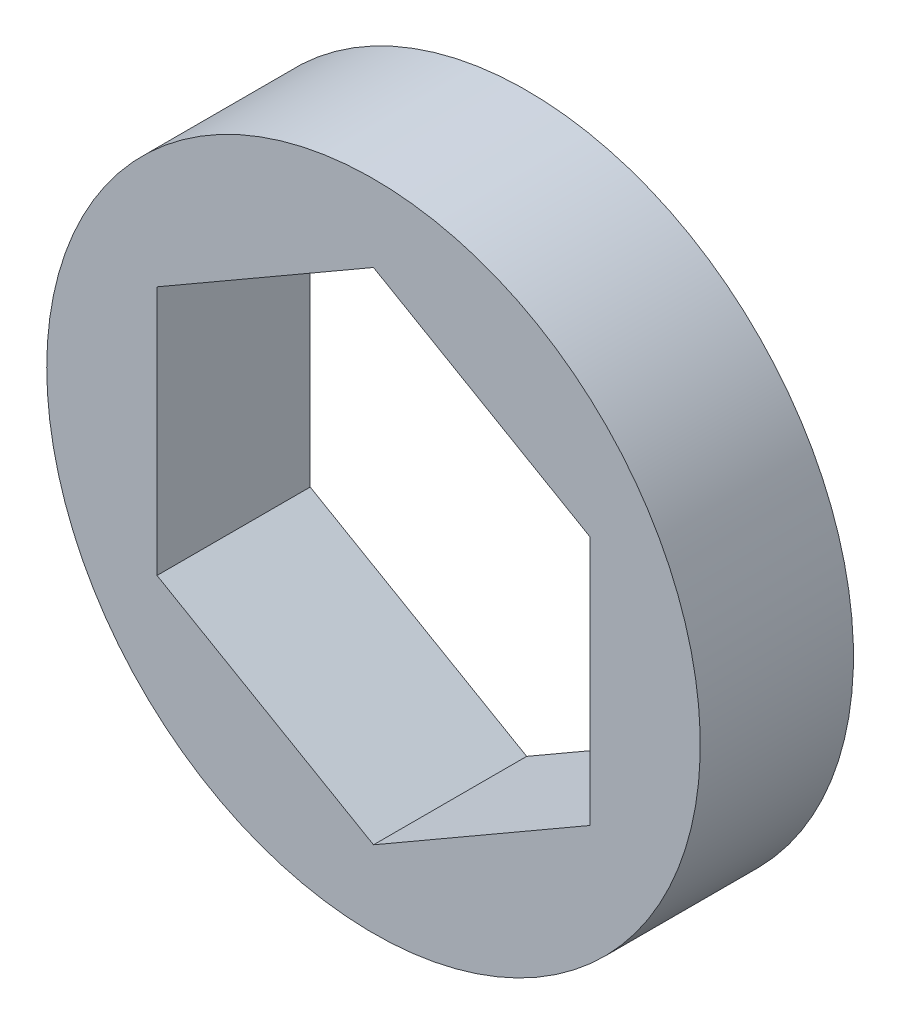
ISO-10303-21;
HEADER;
FILE_DESCRIPTION(('STEP AP214'),'2;1');
FILE_NAME('part.step','',(''),(''),'','','');
FILE_SCHEMA(('AUTOMOTIVE_DESIGN { 1 0 10303 214 1 1 1 1 }'));
ENDSEC;
DATA;
#1=APPLICATION_CONTEXT('core data for automotive mechanical design processes');
#2=APPLICATION_PROTOCOL_DEFINITION('international standard','automotive_design',2000,#1);
#3=PRODUCT_CONTEXT('',#1,'mechanical');
#4=PRODUCT('Part','Part','',(#3));
#5=PRODUCT_RELATED_PRODUCT_CATEGORY('part','',(#4));
#6=PRODUCT_DEFINITION_FORMATION('','',#4);
#7=PRODUCT_DEFINITION_CONTEXT('part definition',#1,'design');
#8=PRODUCT_DEFINITION('design','',#6,#7);
#9=PRODUCT_DEFINITION_SHAPE('','',#8);
#10=(LENGTH_UNIT() NAMED_UNIT(*) SI_UNIT(.MILLI.,.METRE.));
#11=(NAMED_UNIT(*) PLANE_ANGLE_UNIT() SI_UNIT($,.RADIAN.));
#12=(NAMED_UNIT(*) SI_UNIT($,.STERADIAN.) SOLID_ANGLE_UNIT());
#13=UNCERTAINTY_MEASURE_WITH_UNIT(LENGTH_MEASURE(1.E-05),#10,'distance_accuracy_value','');
#14=(GEOMETRIC_REPRESENTATION_CONTEXT(3) GLOBAL_UNCERTAINTY_ASSIGNED_CONTEXT((#13)) GLOBAL_UNIT_ASSIGNED_CONTEXT((#10,
#11,#12)) REPRESENTATION_CONTEXT('',''));
#15=CARTESIAN_POINT('',(0.,0.,0.));
#16=DIRECTION('',(0.,0.,1.));
#17=DIRECTION('',(1.,0.,0.));
#18=AXIS2_PLACEMENT_3D('',#15,#16,#17);
#19=CARTESIAN_POINT('',(0.,0.,2.38125));
#20=DIRECTION('',(0.,0.,1.));
#21=DIRECTION('',(1.,0.,0.));
#22=AXIS2_PLACEMENT_3D('',#19,#20,#21);
#23=PLANE('',#22);
#24=CARTESIAN_POINT('',(0.,0.,2.38125));
#25=DIRECTION('',(0.,0.,1.));
#26=DIRECTION('',(1.,0.,0.));
#27=AXIS2_PLACEMENT_3D('',#24,#25,#26);
#28=CIRCLE('',#27,10.16);
#29=CARTESIAN_POINT('',(-10.16,0.,2.38125));
#30=VERTEX_POINT('',#29);
#31=EDGE_CURVE('E11',#30,#30,#28,.T.);
#32=ORIENTED_EDGE('',*,*,#31,.T.);
#33=EDGE_LOOP('',(#32));
#34=FACE_BOUND('',#33,.T.);
#35=DIRECTION('',(-0.866025403784439,-0.5,0.));
#36=VECTOR('',#35,1.);
#37=CARTESIAN_POINT('',(0.,7.77228932383075,2.38125));
#38=LINE('',#37,#36);
#39=CARTESIAN_POINT('',(0.,7.77228932383075,2.38125));
#40=VERTEX_POINT('',#39);
#41=CARTESIAN_POINT('',(-6.73099999999999,3.88614466191538,2.38125));
#42=VERTEX_POINT('',#41);
#43=EDGE_CURVE('E98',#40,#42,#38,.T.);
#44=ORIENTED_EDGE('',*,*,#43,.F.);
#45=DIRECTION('',(-0.866025403784439,0.5,0.));
#46=VECTOR('',#45,1.);
#47=CARTESIAN_POINT('',(6.73099999999999,3.88614466191539,2.38125));
#48=LINE('',#47,#46);
#49=CARTESIAN_POINT('',(6.73099999999999,3.88614466191539,2.38125));
#50=VERTEX_POINT('',#49);
#51=EDGE_CURVE('E90',#50,#40,#48,.T.);
#52=ORIENTED_EDGE('',*,*,#51,.F.);
#53=DIRECTION('',(0.,1.,0.));
#54=VECTOR('',#53,1.);
#55=CARTESIAN_POINT('',(6.731,-3.88614466191539,2.38125));
#56=LINE('',#55,#54);
#57=CARTESIAN_POINT('',(6.731,-3.88614466191539,2.38125));
#58=VERTEX_POINT('',#57);
#59=EDGE_CURVE('E118',#58,#50,#56,.T.);
#60=ORIENTED_EDGE('',*,*,#59,.F.);
#61=DIRECTION('',(0.866025403784439,0.499999999999999,0.));
#62=VECTOR('',#61,1.);
#63=CARTESIAN_POINT('',(0.,-7.77228932383075,2.38125));
#64=LINE('',#63,#62);
#65=CARTESIAN_POINT('',(0.,-7.77228932383075,2.38125));
#66=VERTEX_POINT('',#65);
#67=EDGE_CURVE('E116',#66,#58,#64,.T.);
#68=ORIENTED_EDGE('',*,*,#67,.F.);
#69=DIRECTION('',(0.866025403784439,-0.499999999999999,0.));
#70=VECTOR('',#69,1.);
#71=CARTESIAN_POINT('',(-6.73099999999999,-3.88614466191539,2.38125));
#72=LINE('',#71,#70);
#73=CARTESIAN_POINT('',(-6.73099999999999,-3.88614466191539,2.38125));
#74=VERTEX_POINT('',#73);
#75=EDGE_CURVE('E112',#74,#66,#72,.T.);
#76=ORIENTED_EDGE('',*,*,#75,.F.);
#77=DIRECTION('',(0.,-1.,0.));
#78=VECTOR('',#77,1.);
#79=CARTESIAN_POINT('',(-6.73099999999999,3.88614466191538,2.38125));
#80=LINE('',#79,#78);
#81=EDGE_CURVE('E110',#42,#74,#80,.T.);
#82=ORIENTED_EDGE('',*,*,#81,.F.);
#83=EDGE_LOOP('',(#44,#52,#60,#68,#76,#82));
#84=FACE_BOUND('',#83,.T.);
#85=ADVANCED_FACE('F37',(#34,#84),#23,.T.);
#86=CARTESIAN_POINT('',(0.,0.,-2.38125));
#87=DIRECTION('',(0.,0.,1.));
#88=DIRECTION('',(1.,0.,0.));
#89=AXIS2_PLACEMENT_3D('',#86,#87,#88);
#90=PLANE('',#89);
#91=CARTESIAN_POINT('',(0.,0.,-2.38125));
#92=DIRECTION('',(0.,0.,1.));
#93=DIRECTION('',(1.,0.,0.));
#94=AXIS2_PLACEMENT_3D('',#91,#92,#93);
#95=CIRCLE('',#94,10.16);
#96=CARTESIAN_POINT('',(-10.16,0.,-2.38125));
#97=VERTEX_POINT('',#96);
#98=EDGE_CURVE('E41',#97,#97,#95,.T.);
#99=ORIENTED_EDGE('',*,*,#98,.F.);
#100=EDGE_LOOP('',(#99));
#101=FACE_BOUND('',#100,.T.);
#102=DIRECTION('',(-0.866025403784439,0.5,0.));
#103=VECTOR('',#102,1.);
#104=CARTESIAN_POINT('',(6.73099999999999,3.88614466191539,-2.38125));
#105=LINE('',#104,#103);
#106=CARTESIAN_POINT('',(6.73099999999999,3.88614466191539,-2.38125));
#107=VERTEX_POINT('',#106);
#108=CARTESIAN_POINT('',(0.,7.77228932383075,-2.38125));
#109=VERTEX_POINT('',#108);
#110=EDGE_CURVE('E60',#107,#109,#105,.T.);
#111=ORIENTED_EDGE('',*,*,#110,.T.);
#112=DIRECTION('',(-0.866025403784439,-0.5,0.));
#113=VECTOR('',#112,1.);
#114=CARTESIAN_POINT('',(0.,7.77228932383075,-2.38125));
#115=LINE('',#114,#113);
#116=CARTESIAN_POINT('',(-6.73099999999999,3.88614466191538,-2.38125));
#117=VERTEX_POINT('',#116);
#118=EDGE_CURVE('E105',#109,#117,#115,.T.);
#119=ORIENTED_EDGE('',*,*,#118,.T.);
#120=DIRECTION('',(0.,-1.,0.));
#121=VECTOR('',#120,1.);
#122=CARTESIAN_POINT('',(-6.73099999999999,3.88614466191538,-2.38125));
#123=LINE('',#122,#121);
#124=CARTESIAN_POINT('',(-6.73099999999999,-3.88614466191539,-2.38125));
#125=VERTEX_POINT('',#124);
#126=EDGE_CURVE('E122',#117,#125,#123,.T.);
#127=ORIENTED_EDGE('',*,*,#126,.T.);
#128=DIRECTION('',(0.866025403784439,-0.499999999999999,0.));
#129=VECTOR('',#128,1.);
#130=CARTESIAN_POINT('',(-6.73099999999999,-3.88614466191539,-2.38125));
#131=LINE('',#130,#129);
#132=CARTESIAN_POINT('',(0.,-7.77228932383075,-2.38125));
#133=VERTEX_POINT('',#132);
#134=EDGE_CURVE('E125',#125,#133,#131,.T.);
#135=ORIENTED_EDGE('',*,*,#134,.T.);
#136=DIRECTION('',(0.866025403784439,0.499999999999999,0.));
#137=VECTOR('',#136,1.);
#138=CARTESIAN_POINT('',(0.,-7.77228932383075,-2.38125));
#139=LINE('',#138,#137);
#140=CARTESIAN_POINT('',(6.731,-3.88614466191539,-2.38125));
#141=VERTEX_POINT('',#140);
#142=EDGE_CURVE('E128',#133,#141,#139,.T.);
#143=ORIENTED_EDGE('',*,*,#142,.T.);
#144=DIRECTION('',(0.,1.,0.));
#145=VECTOR('',#144,1.);
#146=CARTESIAN_POINT('',(6.731,-3.88614466191539,-2.38125));
#147=LINE('',#146,#145);
#148=EDGE_CURVE('E99',#141,#107,#147,.T.);
#149=ORIENTED_EDGE('',*,*,#148,.T.);
#150=EDGE_LOOP('',(#111,#119,#127,#135,#143,#149));
#151=FACE_BOUND('',#150,.T.);
#152=ADVANCED_FACE('F145',(#101,#151),#90,.F.);
#153=CARTESIAN_POINT('',(0.,0.,2.38125));
#154=DIRECTION('',(0.,0.,-1.));
#155=DIRECTION('',(-1.,0.,0.));
#156=AXIS2_PLACEMENT_3D('',#153,#154,#155);
#157=CYLINDRICAL_SURFACE('',#156,10.16);
#158=CARTESIAN_POINT('',(-10.16,0.,2.38125));
#159=CARTESIAN_POINT('',(-10.16,0.,2.331640625));
#160=CARTESIAN_POINT('',(-10.16,0.,2.28203125));
#161=CARTESIAN_POINT('',(-10.16,0.,2.1828125));
#162=CARTESIAN_POINT('',(-10.16,0.,2.133203125));
#163=CARTESIAN_POINT('',(-10.16,0.,2.033984375));
#164=CARTESIAN_POINT('',(-10.16,0.,1.984375));
#165=CARTESIAN_POINT('',(-10.16,0.,1.88515625));
#166=CARTESIAN_POINT('',(-10.16,0.,1.835546875));
#167=CARTESIAN_POINT('',(-10.16,0.,1.736328125));
#168=CARTESIAN_POINT('',(-10.16,0.,1.68671875));
#169=CARTESIAN_POINT('',(-10.16,0.,1.5875));
#170=CARTESIAN_POINT('',(-10.16,0.,1.537890625));
#171=CARTESIAN_POINT('',(-10.16,0.,1.438671875));
#172=CARTESIAN_POINT('',(-10.16,0.,1.3890625));
#173=CARTESIAN_POINT('',(-10.16,0.,1.28984375));
#174=CARTESIAN_POINT('',(-10.16,0.,1.240234375));
#175=CARTESIAN_POINT('',(-10.16,0.,1.141015625));
#176=CARTESIAN_POINT('',(-10.16,0.,1.09140625));
#177=CARTESIAN_POINT('',(-10.16,0.,0.9921875));
#178=CARTESIAN_POINT('',(-10.16,0.,0.942578125));
#179=CARTESIAN_POINT('',(-10.16,0.,0.843359375));
#180=CARTESIAN_POINT('',(-10.16,0.,0.79375));
#181=CARTESIAN_POINT('',(-10.16,0.,0.69453125));
#182=CARTESIAN_POINT('',(-10.16,0.,0.644921875));
#183=CARTESIAN_POINT('',(-10.16,0.,0.545703125));
#184=CARTESIAN_POINT('',(-10.16,0.,0.49609375));
#185=CARTESIAN_POINT('',(-10.16,0.,0.396875));
#186=CARTESIAN_POINT('',(-10.16,0.,0.347265625));
#187=CARTESIAN_POINT('',(-10.16,0.,0.248046875));
#188=CARTESIAN_POINT('',(-10.16,0.,0.1984375));
#189=CARTESIAN_POINT('',(-10.16,0.,0.09921875));
#190=CARTESIAN_POINT('',(-10.16,0.,0.049609375));
#191=CARTESIAN_POINT('',(-10.16,0.,-0.049609375));
#192=CARTESIAN_POINT('',(-10.16,0.,-0.09921875));
#193=CARTESIAN_POINT('',(-10.16,0.,-0.1984375));
#194=CARTESIAN_POINT('',(-10.16,0.,-0.248046875));
#195=CARTESIAN_POINT('',(-10.16,0.,-0.347265625));
#196=CARTESIAN_POINT('',(-10.16,0.,-0.396875));
#197=CARTESIAN_POINT('',(-10.16,0.,-0.49609375));
#198=CARTESIAN_POINT('',(-10.16,0.,-0.545703125));
#199=CARTESIAN_POINT('',(-10.16,0.,-0.644921875));
#200=CARTESIAN_POINT('',(-10.16,0.,-0.69453125));
#201=CARTESIAN_POINT('',(-10.16,0.,-0.79375));
#202=CARTESIAN_POINT('',(-10.16,0.,-0.843359375));
#203=CARTESIAN_POINT('',(-10.16,0.,-0.942578125));
#204=CARTESIAN_POINT('',(-10.16,0.,-0.9921875));
#205=CARTESIAN_POINT('',(-10.16,0.,-1.09140625));
#206=CARTESIAN_POINT('',(-10.16,0.,-1.141015625));
#207=CARTESIAN_POINT('',(-10.16,0.,-1.240234375));
#208=CARTESIAN_POINT('',(-10.16,0.,-1.28984375));
#209=CARTESIAN_POINT('',(-10.16,0.,-1.3890625));
#210=CARTESIAN_POINT('',(-10.16,0.,-1.438671875));
#211=CARTESIAN_POINT('',(-10.16,0.,-1.537890625));
#212=CARTESIAN_POINT('',(-10.16,0.,-1.5875));
#213=CARTESIAN_POINT('',(-10.16,0.,-1.68671875));
#214=CARTESIAN_POINT('',(-10.16,0.,-1.736328125));
#215=CARTESIAN_POINT('',(-10.16,0.,-1.835546875));
#216=CARTESIAN_POINT('',(-10.16,0.,-1.88515625));
#217=CARTESIAN_POINT('',(-10.16,0.,-1.984375));
#218=CARTESIAN_POINT('',(-10.16,0.,-2.033984375));
#219=CARTESIAN_POINT('',(-10.16,0.,-2.133203125));
#220=CARTESIAN_POINT('',(-10.16,0.,-2.1828125));
#221=CARTESIAN_POINT('',(-10.16,0.,-2.28203125));
#222=CARTESIAN_POINT('',(-10.16,0.,-2.331640625));
#223=CARTESIAN_POINT('',(-10.16,0.,-2.38125));
#224=B_SPLINE_CURVE_WITH_KNOTS('',3,(#158,#159,#160,#161,#162,#163,#164,#165,#166,#167,#168,
#169,#170,#171,#172,#173,#174,#175,#176,#177,#178,#179,#180,#181,#182,#183,#184,#185,#186,#187,
#188,#189,#190,#191,#192,#193,#194,#195,#196,#197,#198,#199,#200,#201,#202,#203,#204,#205,#206,
#207,#208,#209,#210,#211,#212,#213,#214,#215,#216,#217,#218,#219,#220,#221,#222,#223),
.UNSPECIFIED.,.F.,.F.,(4,2,2,2,2,2,2,2,2,2,2,2,2,2,2,2,2,2,2,2,2,2,2,2,2,2,2,2,2,2,2,2,4),(0.,
0.148828125,0.29765625,0.446484375,0.5953125,0.744140625,0.89296875,1.041796875,1.190625,
1.339453125,1.48828125,1.637109375,1.7859375,1.934765625,2.08359375,2.232421875,2.38125,
2.530078125,2.67890625,2.827734375,2.9765625,3.125390625,3.27421875,3.423046875,3.571875,
3.720703125,3.86953125,4.018359375,4.1671875,4.316015625,4.46484375,4.613671875,4.7625),.UNSPECIFIED.);
#225=EDGE_CURVE('BSEAM39',#30,#97,#224,.T.);
#226=ORIENTED_EDGE('',*,*,#31,.F.);
#227=ORIENTED_EDGE('',*,*,#98,.T.);
#228=ORIENTED_EDGE('',*,*,#225,.T.);
#229=ORIENTED_EDGE('',*,*,#225,.F.);
#230=EDGE_LOOP('',(#226,#228,#227,#229));
#231=FACE_BOUND('',#230,.T.);
#232=ADVANCED_FACE('F39',(#231),#157,.T.);
#233=CARTESIAN_POINT('',(6.73099999999999,3.88614466191539,2.38125));
#234=DIRECTION('',(-0.5,-0.866025403784439,0.));
#235=DIRECTION('',(0.866025403784439,-0.5,0.));
#236=AXIS2_PLACEMENT_3D('',#233,#234,#235);
#237=PLANE('',#236);
#238=ORIENTED_EDGE('',*,*,#110,.F.);
#239=DIRECTION('',(0.,0.,-1.));
#240=VECTOR('',#239,1.);
#241=CARTESIAN_POINT('',(6.73099999999999,3.88614466191539,2.38125));
#242=LINE('',#241,#240);
#243=EDGE_CURVE('E94',#50,#107,#242,.T.);
#244=ORIENTED_EDGE('',*,*,#243,.F.);
#245=ORIENTED_EDGE('',*,*,#51,.T.);
#246=DIRECTION('',(0.,0.,-1.));
#247=VECTOR('',#246,1.);
#248=CARTESIAN_POINT('',(0.,7.77228932383075,2.38125));
#249=LINE('',#248,#247);
#250=EDGE_CURVE('E93',#40,#109,#249,.T.);
#251=ORIENTED_EDGE('',*,*,#250,.T.);
#252=EDGE_LOOP('',(#238,#244,#245,#251));
#253=FACE_BOUND('',#252,.T.);
#254=ADVANCED_FACE('F92',(#253),#237,.T.);
#255=CARTESIAN_POINT('',(0.,7.77228932383075,2.38125));
#256=DIRECTION('',(0.5,-0.866025403784439,0.));
#257=DIRECTION('',(0.866025403784439,0.5,0.));
#258=AXIS2_PLACEMENT_3D('',#255,#256,#257);
#259=PLANE('',#258);
#260=ORIENTED_EDGE('',*,*,#118,.F.);
#261=ORIENTED_EDGE('',*,*,#250,.F.);
#262=ORIENTED_EDGE('',*,*,#43,.T.);
#263=DIRECTION('',(0.,0.,-1.));
#264=VECTOR('',#263,1.);
#265=CARTESIAN_POINT('',(-6.73099999999999,3.88614466191538,2.38125));
#266=LINE('',#265,#264);
#267=EDGE_CURVE('E106',#42,#117,#266,.T.);
#268=ORIENTED_EDGE('',*,*,#267,.T.);
#269=EDGE_LOOP('',(#260,#261,#262,#268));
#270=FACE_BOUND('',#269,.T.);
#271=ADVANCED_FACE('F102',(#270),#259,.T.);
#272=CARTESIAN_POINT('',(-6.73099999999999,3.88614466191538,2.38125));
#273=DIRECTION('',(1.,0.,0.));
#274=DIRECTION('',(0.,0.,-1.));
#275=AXIS2_PLACEMENT_3D('',#272,#273,#274);
#276=PLANE('',#275);
#277=ORIENTED_EDGE('',*,*,#126,.F.);
#278=ORIENTED_EDGE('',*,*,#267,.F.);
#279=ORIENTED_EDGE('',*,*,#81,.T.);
#280=DIRECTION('',(0.,0.,-1.));
#281=VECTOR('',#280,1.);
#282=CARTESIAN_POINT('',(-6.73099999999999,-3.88614466191539,2.38125));
#283=LINE('',#282,#281);
#284=EDGE_CURVE('E137',#74,#125,#283,.T.);
#285=ORIENTED_EDGE('',*,*,#284,.T.);
#286=EDGE_LOOP('',(#277,#278,#279,#285));
#287=FACE_BOUND('',#286,.T.);
#288=ADVANCED_FACE('F141',(#287),#276,.T.);
#289=CARTESIAN_POINT('',(-6.73099999999999,-3.88614466191539,2.38125));
#290=DIRECTION('',(0.499999999999999,0.866025403784439,0.));
#291=DIRECTION('',(-0.866025403784439,0.499999999999999,0.));
#292=AXIS2_PLACEMENT_3D('',#289,#290,#291);
#293=PLANE('',#292);
#294=ORIENTED_EDGE('',*,*,#134,.F.);
#295=ORIENTED_EDGE('',*,*,#284,.F.);
#296=ORIENTED_EDGE('',*,*,#75,.T.);
#297=DIRECTION('',(0.,0.,-1.));
#298=VECTOR('',#297,1.);
#299=CARTESIAN_POINT('',(0.,-7.77228932383075,2.38125));
#300=LINE('',#299,#298);
#301=EDGE_CURVE('E135',#66,#133,#300,.T.);
#302=ORIENTED_EDGE('',*,*,#301,.T.);
#303=EDGE_LOOP('',(#294,#295,#296,#302));
#304=FACE_BOUND('',#303,.T.);
#305=ADVANCED_FACE('F153',(#304),#293,.T.);
#306=CARTESIAN_POINT('',(0.,-7.77228932383075,2.38125));
#307=DIRECTION('',(-0.499999999999999,0.866025403784439,0.));
#308=DIRECTION('',(-0.866025403784439,-0.499999999999999,0.));
#309=AXIS2_PLACEMENT_3D('',#306,#307,#308);
#310=PLANE('',#309);
#311=ORIENTED_EDGE('',*,*,#142,.F.);
#312=ORIENTED_EDGE('',*,*,#301,.F.);
#313=ORIENTED_EDGE('',*,*,#67,.T.);
#314=DIRECTION('',(0.,0.,-1.));
#315=VECTOR('',#314,1.);
#316=CARTESIAN_POINT('',(6.731,-3.88614466191539,2.38125));
#317=LINE('',#316,#315);
#318=EDGE_CURVE('E52',#58,#141,#317,.T.);
#319=ORIENTED_EDGE('',*,*,#318,.T.);
#320=EDGE_LOOP('',(#311,#312,#313,#319));
#321=FACE_BOUND('',#320,.T.);
#322=ADVANCED_FACE('F151',(#321),#310,.T.);
#323=CARTESIAN_POINT('',(6.731,-3.88614466191539,2.38125));
#324=DIRECTION('',(-1.,0.,0.));
#325=DIRECTION('',(0.,-1.,0.));
#326=AXIS2_PLACEMENT_3D('',#323,#324,#325);
#327=PLANE('',#326);
#328=ORIENTED_EDGE('',*,*,#148,.F.);
#329=ORIENTED_EDGE('',*,*,#318,.F.);
#330=ORIENTED_EDGE('',*,*,#59,.T.);
#331=ORIENTED_EDGE('',*,*,#243,.T.);
#332=EDGE_LOOP('',(#328,#329,#330,#331));
#333=FACE_BOUND('',#332,.T.);
#334=ADVANCED_FACE('F147',(#333),#327,.T.);
#335=CLOSED_SHELL('',(#85,#152,#232,#254,#271,#288,#305,#322,#334));
#336=MANIFOLD_SOLID_BREP('B2',#335);
#337=ADVANCED_BREP_SHAPE_REPRESENTATION('',(#18,#336),#14);
#338=SHAPE_DEFINITION_REPRESENTATION(#9,#337);
ENDSEC;
END-ISO-10303-21;
